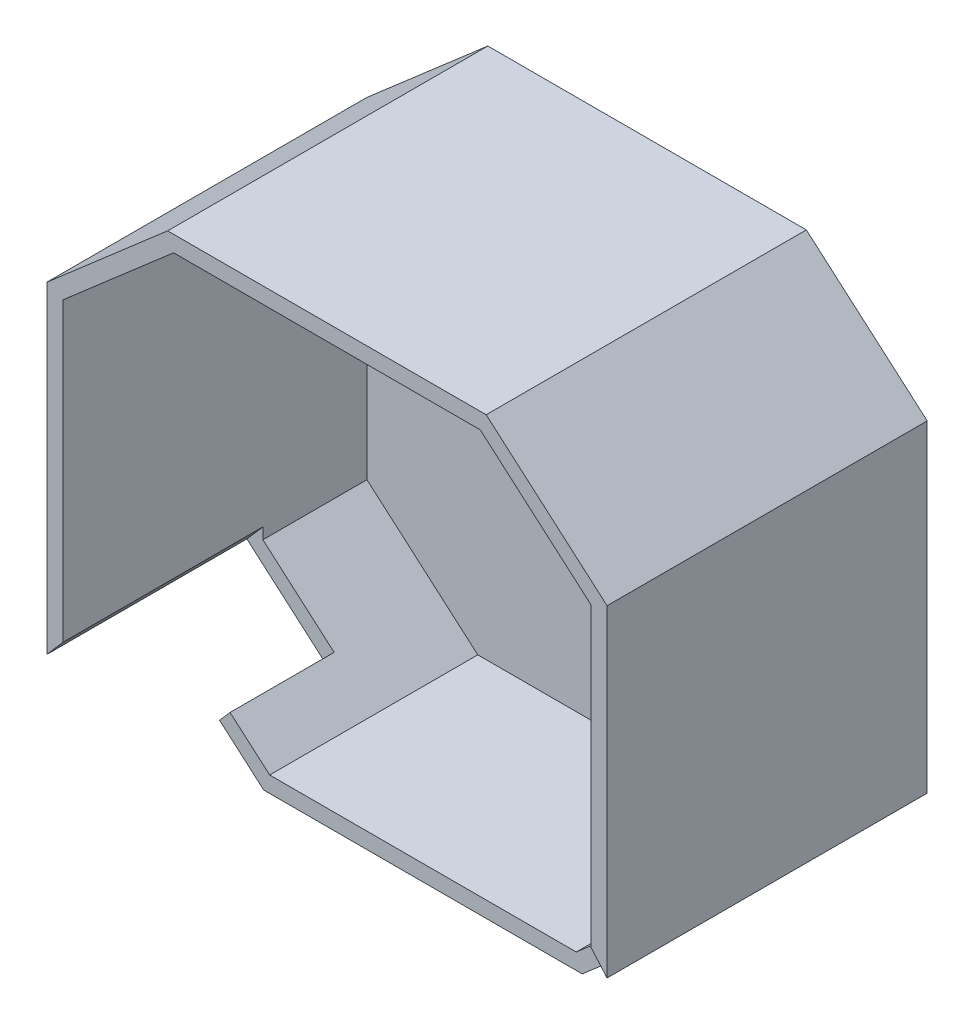
ISO-10303-21;
HEADER;
FILE_DESCRIPTION(('STEP AP214'),'2;1');
FILE_NAME('part.step','',(''),(''),'','','');
FILE_SCHEMA(('AUTOMOTIVE_DESIGN { 1 0 10303 214 1 1 1 1 }'));
ENDSEC;
DATA;
#1=APPLICATION_CONTEXT('core data for automotive mechanical design processes');
#2=APPLICATION_PROTOCOL_DEFINITION('international standard','automotive_design',2000,#1);
#3=PRODUCT_CONTEXT('',#1,'mechanical');
#4=PRODUCT('Part','Part','',(#3));
#5=PRODUCT_RELATED_PRODUCT_CATEGORY('part','',(#4));
#6=PRODUCT_DEFINITION_FORMATION('','',#4);
#7=PRODUCT_DEFINITION_CONTEXT('part definition',#1,'design');
#8=PRODUCT_DEFINITION('design','',#6,#7);
#9=PRODUCT_DEFINITION_SHAPE('','',#8);
#10=(LENGTH_UNIT() NAMED_UNIT(*) SI_UNIT(.MILLI.,.METRE.));
#11=(NAMED_UNIT(*) PLANE_ANGLE_UNIT() SI_UNIT($,.RADIAN.));
#12=(NAMED_UNIT(*) SI_UNIT($,.STERADIAN.) SOLID_ANGLE_UNIT());
#13=UNCERTAINTY_MEASURE_WITH_UNIT(LENGTH_MEASURE(1.E-05),#10,'distance_accuracy_value','');
#14=(GEOMETRIC_REPRESENTATION_CONTEXT(3) GLOBAL_UNCERTAINTY_ASSIGNED_CONTEXT((#13)) GLOBAL_UNIT_ASSIGNED_CONTEXT((#10,
#11,#12)) REPRESENTATION_CONTEXT('',''));
#15=CARTESIAN_POINT('',(0.,0.,0.));
#16=DIRECTION('',(0.,0.,1.));
#17=DIRECTION('',(1.,0.,0.));
#18=AXIS2_PLACEMENT_3D('',#15,#16,#17);
#19=CARTESIAN_POINT('',(-33.,-19.2266908634023,40.));
#20=DIRECTION('',(1.,0.,0.));
#21=DIRECTION('',(0.,0.,-1.));
#22=AXIS2_PLACEMENT_3D('',#19,#20,#21);
#23=PLANE('',#22);
#24=DIRECTION('',(0.,0.,-1.));
#25=VECTOR('',#24,1.);
#26=CARTESIAN_POINT('',(-33.,-19.2266908634023,40.));
#27=LINE('',#26,#25);
#28=CARTESIAN_POINT('',(-33.,-19.2266908634023,15.));
#29=VERTEX_POINT('',#28);
#30=CARTESIAN_POINT('',(-33.,-19.2266908634023,2.));
#31=VERTEX_POINT('',#30);
#32=EDGE_CURVE('E227',#29,#31,#27,.T.);
#33=ORIENTED_EDGE('',*,*,#32,.T.);
#34=DIRECTION('',(0.,-1.,0.));
#35=VECTOR('',#34,1.);
#36=CARTESIAN_POINT('',(-33.,-19.2266908634023,2.));
#37=LINE('',#36,#35);
#38=CARTESIAN_POINT('',(-33.,19.2266908634023,2.));
#39=VERTEX_POINT('',#38);
#40=EDGE_CURVE('E214',#39,#31,#37,.T.);
#41=ORIENTED_EDGE('',*,*,#40,.F.);
#42=DIRECTION('',(0.,0.,-1.));
#43=VECTOR('',#42,1.);
#44=CARTESIAN_POINT('',(-33.,19.2266908634023,40.));
#45=LINE('',#44,#43);
#46=CARTESIAN_POINT('',(-33.,19.2266908634023,40.));
#47=VERTEX_POINT('',#46);
#48=EDGE_CURVE('E212',#47,#39,#45,.T.);
#49=ORIENTED_EDGE('',*,*,#48,.F.);
#50=DIRECTION('',(0.,-1.,0.));
#51=VECTOR('',#50,1.);
#52=CARTESIAN_POINT('',(-33.,-19.2266908634023,40.));
#53=LINE('',#52,#51);
#54=CARTESIAN_POINT('',(-33.,-17.8350958867525,40.));
#55=VERTEX_POINT('',#54);
#56=EDGE_CURVE('E390',#47,#55,#53,.T.);
#57=ORIENTED_EDGE('',*,*,#56,.T.);
#58=DIRECTION('',(0.,0.,1.));
#59=VECTOR('',#58,1.);
#60=CARTESIAN_POINT('',(-33.,-17.8350958867525,15.));
#61=LINE('',#60,#59);
#62=CARTESIAN_POINT('',(-33.,-17.8350958867525,15.));
#63=VERTEX_POINT('',#62);
#64=EDGE_CURVE('E477',#63,#55,#61,.T.);
#65=ORIENTED_EDGE('',*,*,#64,.F.);
#66=DIRECTION('',(0.,1.,0.));
#67=VECTOR('',#66,1.);
#68=CARTESIAN_POINT('',(-33.,44.9600377626451,15.));
#69=LINE('',#68,#67);
#70=EDGE_CURVE('E351',#29,#63,#69,.T.);
#71=ORIENTED_EDGE('',*,*,#70,.F.);
#72=EDGE_LOOP('',(#33,#41,#49,#57,#65,#71));
#73=FACE_BOUND('',#72,.T.);
#74=ADVANCED_FACE('F39',(#73),#23,.T.);
#75=CARTESIAN_POINT('',(-19.15,-31.25,40.));
#76=DIRECTION('',(0.655552292940518,0.755149780653103,0.));
#77=DIRECTION('',(-0.755149780653103,0.655552292940518,0.));
#78=AXIS2_PLACEMENT_3D('',#75,#76,#77);
#79=PLANE('',#78);
#80=DIRECTION('',(0.,0.,-1.));
#81=VECTOR('',#80,1.);
#82=CARTESIAN_POINT('',(-19.15,-31.25,40.));
#83=LINE('',#82,#81);
#84=CARTESIAN_POINT('',(-19.15,-31.25,28.));
#85=VERTEX_POINT('',#84);
#86=CARTESIAN_POINT('',(-19.15,-31.25,2.));
#87=VERTEX_POINT('',#86);
#88=EDGE_CURVE('E414',#85,#87,#83,.T.);
#89=ORIENTED_EDGE('',*,*,#88,.T.);
#90=DIRECTION('',(0.755149780653103,-0.655552292940518,0.));
#91=VECTOR('',#90,1.);
#92=CARTESIAN_POINT('',(-19.15,-31.25,2.));
#93=LINE('',#92,#91);
#94=EDGE_CURVE('E428',#31,#87,#93,.T.);
#95=ORIENTED_EDGE('',*,*,#94,.F.);
#96=ORIENTED_EDGE('',*,*,#32,.F.);
#97=DIRECTION('',(-0.755149780653103,0.655552292940518,0.));
#98=VECTOR('',#97,1.);
#99=CARTESIAN_POINT('',(-33.688895414119,-18.6286545798834,15.));
#100=LINE('',#99,#98);
#101=CARTESIAN_POINT('',(-24.0984931998246,-26.954168700228,15.));
#102=VERTEX_POINT('',#101);
#103=EDGE_CURVE('E358',#102,#29,#100,.T.);
#104=ORIENTED_EDGE('',*,*,#103,.F.);
#105=DIRECTION('',(0.,0.,-1.));
#106=VECTOR('',#105,1.);
#107=CARTESIAN_POINT('',(-24.0984931998246,-26.954168700228,15.));
#108=LINE('',#107,#106);
#109=CARTESIAN_POINT('',(-24.0984931998246,-26.954168700228,28.));
#110=VERTEX_POINT('',#109);
#111=EDGE_CURVE('E474',#110,#102,#108,.T.);
#112=ORIENTED_EDGE('',*,*,#111,.F.);
#113=DIRECTION('',(0.755149780653103,-0.655552292940518,0.));
#114=VECTOR('',#113,1.);
#115=CARTESIAN_POINT('',(-56.3774509408511,1.06748382883579,28.));
#116=LINE('',#115,#114);
#117=EDGE_CURVE('E63',#110,#85,#116,.T.);
#118=ORIENTED_EDGE('',*,*,#117,.T.);
#119=EDGE_LOOP('',(#89,#95,#96,#104,#112,#118));
#120=FACE_BOUND('',#119,.T.);
#121=ADVANCED_FACE('F426',(#120),#79,.T.);
#122=CARTESIAN_POINT('',(-19.15,31.25,40.));
#123=DIRECTION('',(0.,-1.,0.));
#124=DIRECTION('',(1.,0.,0.));
#125=AXIS2_PLACEMENT_3D('',#122,#123,#124);
#126=PLANE('',#125);
#127=DIRECTION('',(0.,0.,-1.));
#128=VECTOR('',#127,1.);
#129=CARTESIAN_POINT('',(-19.15,31.25,40.));
#130=LINE('',#129,#128);
#131=CARTESIAN_POINT('',(-19.15,31.25,40.));
#132=VERTEX_POINT('',#131);
#133=CARTESIAN_POINT('',(-19.15,31.25,2.));
#134=VERTEX_POINT('',#133);
#135=EDGE_CURVE('E209',#132,#134,#130,.T.);
#136=ORIENTED_EDGE('',*,*,#135,.T.);
#137=DIRECTION('',(-1.,0.,0.));
#138=VECTOR('',#137,1.);
#139=CARTESIAN_POINT('',(-19.15,31.25,2.));
#140=LINE('',#139,#138);
#141=CARTESIAN_POINT('',(19.15,31.25,2.));
#142=VERTEX_POINT('',#141);
#143=EDGE_CURVE('E193',#142,#134,#140,.T.);
#144=ORIENTED_EDGE('',*,*,#143,.F.);
#145=DIRECTION('',(0.,0.,-1.));
#146=VECTOR('',#145,1.);
#147=CARTESIAN_POINT('',(19.15,31.25,40.));
#148=LINE('',#147,#146);
#149=CARTESIAN_POINT('',(19.15,31.25,40.));
#150=VERTEX_POINT('',#149);
#151=EDGE_CURVE('E399',#150,#142,#148,.T.);
#152=ORIENTED_EDGE('',*,*,#151,.F.);
#153=DIRECTION('',(-1.,0.,0.));
#154=VECTOR('',#153,1.);
#155=CARTESIAN_POINT('',(-19.15,31.25,40.));
#156=LINE('',#155,#154);
#157=EDGE_CURVE('E218',#150,#132,#156,.T.);
#158=ORIENTED_EDGE('',*,*,#157,.T.);
#159=EDGE_LOOP('',(#136,#144,#152,#158));
#160=FACE_BOUND('',#159,.T.);
#161=ADVANCED_FACE('F216',(#160),#126,.T.);
#162=CARTESIAN_POINT('',(-19.15,31.25,40.));
#163=DIRECTION('',(0.655552292940518,-0.755149780653103,0.));
#164=DIRECTION('',(0.755149780653103,0.655552292940518,0.));
#165=AXIS2_PLACEMENT_3D('',#162,#163,#164);
#166=PLANE('',#165);
#167=ORIENTED_EDGE('',*,*,#48,.T.);
#168=DIRECTION('',(-0.755149780653103,-0.655552292940518,0.));
#169=VECTOR('',#168,1.);
#170=CARTESIAN_POINT('',(-33.,19.2266908634023,2.));
#171=LINE('',#170,#169);
#172=EDGE_CURVE('E196',#134,#39,#171,.T.);
#173=ORIENTED_EDGE('',*,*,#172,.F.);
#174=ORIENTED_EDGE('',*,*,#135,.F.);
#175=DIRECTION('',(-0.755149780653103,-0.655552292940518,0.));
#176=VECTOR('',#175,1.);
#177=CARTESIAN_POINT('',(-19.15,31.25,40.));
#178=LINE('',#177,#176);
#179=EDGE_CURVE('E387',#132,#47,#178,.T.);
#180=ORIENTED_EDGE('',*,*,#179,.T.);
#181=EDGE_LOOP('',(#167,#173,#174,#180));
#182=FACE_BOUND('',#181,.T.);
#183=ADVANCED_FACE('F208',(#182),#166,.T.);
#184=CARTESIAN_POINT('',(-19.15,-31.25,40.));
#185=DIRECTION('',(0.,1.,0.));
#186=DIRECTION('',(0.,0.,1.));
#187=AXIS2_PLACEMENT_3D('',#184,#185,#186);
#188=PLANE('',#187);
#189=DIRECTION('',(0.,0.,-1.));
#190=VECTOR('',#189,1.);
#191=CARTESIAN_POINT('',(19.15,-31.25,40.));
#192=LINE('',#191,#190);
#193=CARTESIAN_POINT('',(19.15,-31.25,28.));
#194=VERTEX_POINT('',#193);
#195=CARTESIAN_POINT('',(19.15,-31.25,2.));
#196=VERTEX_POINT('',#195);
#197=EDGE_CURVE('E410',#194,#196,#192,.T.);
#198=ORIENTED_EDGE('',*,*,#197,.T.);
#199=DIRECTION('',(1.,0.,0.));
#200=VECTOR('',#199,1.);
#201=CARTESIAN_POINT('',(19.15,-31.25,2.));
#202=LINE('',#201,#200);
#203=EDGE_CURVE('E432',#87,#196,#202,.T.);
#204=ORIENTED_EDGE('',*,*,#203,.F.);
#205=ORIENTED_EDGE('',*,*,#88,.F.);
#206=DIRECTION('',(1.,0.,0.));
#207=VECTOR('',#206,1.);
#208=CARTESIAN_POINT('',(-28.438652094021,-31.25,28.));
#209=LINE('',#208,#207);
#210=EDGE_CURVE('E460',#85,#194,#209,.T.);
#211=ORIENTED_EDGE('',*,*,#210,.T.);
#212=EDGE_LOOP('',(#198,#204,#205,#211));
#213=FACE_BOUND('',#212,.T.);
#214=ADVANCED_FACE('F500',(#213),#188,.T.);
#215=CARTESIAN_POINT('',(19.15,-31.25,40.));
#216=DIRECTION('',(-0.655552292940518,0.755149780653103,0.));
#217=DIRECTION('',(-0.755149780653103,-0.655552292940518,0.));
#218=AXIS2_PLACEMENT_3D('',#215,#216,#217);
#219=PLANE('',#218);
#220=DIRECTION('',(0.,0.,-1.));
#221=VECTOR('',#220,1.);
#222=CARTESIAN_POINT('',(33.,-19.2266908634023,40.));
#223=LINE('',#222,#221);
#224=CARTESIAN_POINT('',(33.,-19.2266908634023,15.));
#225=VERTEX_POINT('',#224);
#226=CARTESIAN_POINT('',(33.,-19.2266908634023,2.));
#227=VERTEX_POINT('',#226);
#228=EDGE_CURVE('E406',#225,#227,#223,.T.);
#229=ORIENTED_EDGE('',*,*,#228,.T.);
#230=DIRECTION('',(0.755149780653103,0.655552292940518,0.));
#231=VECTOR('',#230,1.);
#232=CARTESIAN_POINT('',(33.,-19.2266908634023,2.));
#233=LINE('',#232,#231);
#234=EDGE_CURVE('E436',#196,#227,#233,.T.);
#235=ORIENTED_EDGE('',*,*,#234,.F.);
#236=ORIENTED_EDGE('',*,*,#197,.F.);
#237=DIRECTION('',(0.755149780653103,0.655552292940518,0.));
#238=VECTOR('',#237,1.);
#239=CARTESIAN_POINT('',(23.9431004742134,-27.0890665181054,28.));
#240=LINE('',#239,#238);
#241=CARTESIAN_POINT('',(24.0984931998246,-26.954168700228,28.));
#242=VERTEX_POINT('',#241);
#243=EDGE_CURVE('E464',#194,#242,#240,.T.);
#244=ORIENTED_EDGE('',*,*,#243,.T.);
#245=DIRECTION('',(0.,0.,-1.));
#246=VECTOR('',#245,1.);
#247=CARTESIAN_POINT('',(24.0984931998246,-26.954168700228,15.));
#248=LINE('',#247,#246);
#249=CARTESIAN_POINT('',(24.0984931998246,-26.954168700228,15.));
#250=VERTEX_POINT('',#249);
#251=EDGE_CURVE('E375',#242,#250,#248,.T.);
#252=ORIENTED_EDGE('',*,*,#251,.T.);
#253=DIRECTION('',(0.755149780653103,0.655552292940518,0.));
#254=VECTOR('',#253,1.);
#255=CARTESIAN_POINT('',(33.688895414119,-18.6286545798834,15.));
#256=LINE('',#255,#254);
#257=EDGE_CURVE('E350',#250,#225,#256,.T.);
#258=ORIENTED_EDGE('',*,*,#257,.T.);
#259=EDGE_LOOP('',(#229,#235,#236,#244,#252,#258));
#260=FACE_BOUND('',#259,.T.);
#261=ADVANCED_FACE('F504',(#260),#219,.T.);
#262=CARTESIAN_POINT('',(33.,-19.2266908634023,40.));
#263=DIRECTION('',(-1.,0.,0.));
#264=DIRECTION('',(0.,0.,1.));
#265=AXIS2_PLACEMENT_3D('',#262,#263,#264);
#266=PLANE('',#265);
#267=DIRECTION('',(0.,0.,-1.));
#268=VECTOR('',#267,1.);
#269=CARTESIAN_POINT('',(33.,19.2266908634023,40.));
#270=LINE('',#269,#268);
#271=CARTESIAN_POINT('',(33.,19.2266908634023,40.));
#272=VERTEX_POINT('',#271);
#273=CARTESIAN_POINT('',(33.,19.2266908634023,2.));
#274=VERTEX_POINT('',#273);
#275=EDGE_CURVE('E402',#272,#274,#270,.T.);
#276=ORIENTED_EDGE('',*,*,#275,.T.);
#277=DIRECTION('',(0.,1.,0.));
#278=VECTOR('',#277,1.);
#279=CARTESIAN_POINT('',(33.,19.2266908634023,2.));
#280=LINE('',#279,#278);
#281=EDGE_CURVE('E55',#227,#274,#280,.T.);
#282=ORIENTED_EDGE('',*,*,#281,.F.);
#283=ORIENTED_EDGE('',*,*,#228,.F.);
#284=DIRECTION('',(0.,1.,0.));
#285=VECTOR('',#284,1.);
#286=CARTESIAN_POINT('',(33.,44.9600377626451,15.));
#287=LINE('',#286,#285);
#288=CARTESIAN_POINT('',(33.,-17.8350958867525,15.));
#289=VERTEX_POINT('',#288);
#290=EDGE_CURVE('E381',#225,#289,#287,.T.);
#291=ORIENTED_EDGE('',*,*,#290,.T.);
#292=DIRECTION('',(0.,0.,1.));
#293=VECTOR('',#292,1.);
#294=CARTESIAN_POINT('',(33.,-17.8350958867525,15.));
#295=LINE('',#294,#293);
#296=CARTESIAN_POINT('',(33.,-17.8350958867525,40.));
#297=VERTEX_POINT('',#296);
#298=EDGE_CURVE('E356',#289,#297,#295,.T.);
#299=ORIENTED_EDGE('',*,*,#298,.T.);
#300=DIRECTION('',(0.,1.,0.));
#301=VECTOR('',#300,1.);
#302=CARTESIAN_POINT('',(33.,-19.2266908634023,40.));
#303=LINE('',#302,#301);
#304=EDGE_CURVE('E346',#297,#272,#303,.T.);
#305=ORIENTED_EDGE('',*,*,#304,.T.);
#306=EDGE_LOOP('',(#276,#282,#283,#291,#299,#305));
#307=FACE_BOUND('',#306,.T.);
#308=ADVANCED_FACE('F508',(#307),#266,.T.);
#309=CARTESIAN_POINT('',(19.15,31.25,40.));
#310=DIRECTION('',(-0.655552292940518,-0.755149780653103,0.));
#311=DIRECTION('',(0.755149780653103,-0.655552292940518,0.));
#312=AXIS2_PLACEMENT_3D('',#309,#310,#311);
#313=PLANE('',#312);
#314=ORIENTED_EDGE('',*,*,#151,.T.);
#315=DIRECTION('',(-0.755149780653103,0.655552292940518,0.));
#316=VECTOR('',#315,1.);
#317=CARTESIAN_POINT('',(19.15,31.25,2.));
#318=LINE('',#317,#316);
#319=EDGE_CURVE('E198',#274,#142,#318,.T.);
#320=ORIENTED_EDGE('',*,*,#319,.F.);
#321=ORIENTED_EDGE('',*,*,#275,.F.);
#322=DIRECTION('',(-0.755149780653103,0.655552292940518,0.));
#323=VECTOR('',#322,1.);
#324=CARTESIAN_POINT('',(19.15,31.25,40.));
#325=LINE('',#324,#323);
#326=EDGE_CURVE('E396',#272,#150,#325,.T.);
#327=ORIENTED_EDGE('',*,*,#326,.T.);
#328=EDGE_LOOP('',(#314,#320,#321,#327));
#329=FACE_BOUND('',#328,.T.);
#330=ADVANCED_FACE('F511',(#329),#313,.T.);
#331=CARTESIAN_POINT('',(0.,0.,40.));
#332=DIRECTION('',(0.,0.,1.));
#333=DIRECTION('',(1.,0.,0.));
#334=AXIS2_PLACEMENT_3D('',#331,#332,#333);
#335=PLANE('',#334);
#336=DIRECTION('',(0.,-1.,0.));
#337=VECTOR('',#336,1.);
#338=CARTESIAN_POINT('',(-35.,-20.1389541411896,40.));
#339=LINE('',#338,#337);
#340=CARTESIAN_POINT('',(-35.,20.1389541411896,40.));
#341=VERTEX_POINT('',#340);
#342=CARTESIAN_POINT('',(-35.,-20.1389541411896,40.));
#343=VERTEX_POINT('',#342);
#344=EDGE_CURVE('E239',#341,#343,#339,.T.);
#345=ORIENTED_EDGE('',*,*,#344,.T.);
#346=DIRECTION('',(-0.655552292940518,-0.755149780653103,0.));
#347=VECTOR('',#346,1.);
#348=CARTESIAN_POINT('',(21.513018349507,44.9600377626451,40.));
#349=LINE('',#348,#347);
#350=EDGE_CURVE('E471',#55,#343,#349,.T.);
#351=ORIENTED_EDGE('',*,*,#350,.F.);
#352=ORIENTED_EDGE('',*,*,#56,.F.);
#353=ORIENTED_EDGE('',*,*,#179,.F.);
#354=ORIENTED_EDGE('',*,*,#157,.F.);
#355=ORIENTED_EDGE('',*,*,#326,.F.);
#356=ORIENTED_EDGE('',*,*,#304,.F.);
#357=DIRECTION('',(0.655552292940518,-0.755149780653103,0.));
#358=VECTOR('',#357,1.);
#359=CARTESIAN_POINT('',(-21.513018349507,44.9600377626451,40.));
#360=LINE('',#359,#358);
#361=CARTESIAN_POINT('',(35.,-20.1389541411896,40.));
#362=VERTEX_POINT('',#361);
#363=EDGE_CURVE('E344',#297,#362,#360,.T.);
#364=ORIENTED_EDGE('',*,*,#363,.T.);
#365=DIRECTION('',(0.,1.,0.));
#366=VECTOR('',#365,1.);
#367=CARTESIAN_POINT('',(35.,-20.1389541411896,40.));
#368=LINE('',#367,#366);
#369=CARTESIAN_POINT('',(35.,20.1389541411896,40.));
#370=VERTEX_POINT('',#369);
#371=EDGE_CURVE('E243',#362,#370,#368,.T.);
#372=ORIENTED_EDGE('',*,*,#371,.T.);
#373=DIRECTION('',(-0.755149780653103,0.655552292940518,0.));
#374=VECTOR('',#373,1.);
#375=CARTESIAN_POINT('',(19.8970043869379,33.25,40.));
#376=LINE('',#375,#374);
#377=CARTESIAN_POINT('',(19.8970043869379,33.25,40.));
#378=VERTEX_POINT('',#377);
#379=EDGE_CURVE('E246',#370,#378,#376,.T.);
#380=ORIENTED_EDGE('',*,*,#379,.T.);
#381=DIRECTION('',(-1.,0.,0.));
#382=VECTOR('',#381,1.);
#383=CARTESIAN_POINT('',(-19.8970043869379,33.25,40.));
#384=LINE('',#383,#382);
#385=CARTESIAN_POINT('',(-19.8970043869379,33.25,40.));
#386=VERTEX_POINT('',#385);
#387=EDGE_CURVE('E231',#378,#386,#384,.T.);
#388=ORIENTED_EDGE('',*,*,#387,.T.);
#389=DIRECTION('',(-0.755149780653103,-0.655552292940518,0.));
#390=VECTOR('',#389,1.);
#391=CARTESIAN_POINT('',(-19.8970043869379,33.25,40.));
#392=LINE('',#391,#390);
#393=EDGE_CURVE('E235',#386,#341,#392,.T.);
#394=ORIENTED_EDGE('',*,*,#393,.T.);
#395=EDGE_LOOP('',(#345,#351,#352,#353,#354,#355,#356,#364,#372,#380,#388,#394));
#396=FACE_BOUND('',#395,.T.);
#397=ADVANCED_FACE('F341',(#396),#335,.T.);
#398=CARTESIAN_POINT('',(-19.8970043869379,-33.25,40.));
#399=DIRECTION('',(0.655552292940518,0.755149780653103,0.));
#400=DIRECTION('',(-0.755149780653103,0.655552292940518,0.));
#401=AXIS2_PLACEMENT_3D('',#398,#399,#400);
#402=PLANE('',#401);
#403=DIRECTION('',(0.,0.,-1.));
#404=VECTOR('',#403,1.);
#405=CARTESIAN_POINT('',(-19.8970043869379,-33.25,40.));
#406=LINE('',#405,#404);
#407=CARTESIAN_POINT('',(-19.8970043869379,-33.25,28.));
#408=VERTEX_POINT('',#407);
#409=CARTESIAN_POINT('',(-19.8970043869379,-33.25,0.));
#410=VERTEX_POINT('',#409);
#411=EDGE_CURVE('E288',#408,#410,#406,.T.);
#412=ORIENTED_EDGE('',*,*,#411,.F.);
#413=DIRECTION('',(0.755149780653103,-0.655552292940518,0.));
#414=VECTOR('',#413,1.);
#415=CARTESIAN_POINT('',(-57.6885555267321,-0.44281573247041,28.));
#416=LINE('',#415,#414);
#417=CARTESIAN_POINT('',(-25.4095977857056,-28.4644682615342,28.));
#418=VERTEX_POINT('',#417);
#419=EDGE_CURVE('E449',#418,#408,#416,.T.);
#420=ORIENTED_EDGE('',*,*,#419,.F.);
#421=DIRECTION('',(0.,0.,-1.));
#422=VECTOR('',#421,1.);
#423=CARTESIAN_POINT('',(-25.4095977857056,-28.4644682615342,15.));
#424=LINE('',#423,#422);
#425=CARTESIAN_POINT('',(-25.4095977857056,-28.4644682615342,15.));
#426=VERTEX_POINT('',#425);
#427=EDGE_CURVE('E482',#418,#426,#424,.T.);
#428=ORIENTED_EDGE('',*,*,#427,.T.);
#429=DIRECTION('',(-0.755149780653103,0.655552292940518,0.));
#430=VECTOR('',#429,1.);
#431=CARTESIAN_POINT('',(-35.,-20.1389541411896,15.));
#432=LINE('',#431,#430);
#433=CARTESIAN_POINT('',(-35.,-20.1389541411896,15.));
#434=VERTEX_POINT('',#433);
#435=EDGE_CURVE('E317',#426,#434,#432,.T.);
#436=ORIENTED_EDGE('',*,*,#435,.T.);
#437=DIRECTION('',(0.,0.,-1.));
#438=VECTOR('',#437,1.);
#439=CARTESIAN_POINT('',(-35.,-20.1389541411896,40.));
#440=LINE('',#439,#438);
#441=CARTESIAN_POINT('',(-35.,-20.1389541411896,0.));
#442=VERTEX_POINT('',#441);
#443=EDGE_CURVE('E291',#434,#442,#440,.T.);
#444=ORIENTED_EDGE('',*,*,#443,.T.);
#445=DIRECTION('',(0.755149780653103,-0.655552292940518,0.));
#446=VECTOR('',#445,1.);
#447=CARTESIAN_POINT('',(-19.8970043869379,-33.25,0.));
#448=LINE('',#447,#446);
#449=EDGE_CURVE('E256',#442,#410,#448,.T.);
#450=ORIENTED_EDGE('',*,*,#449,.T.);
#451=EDGE_LOOP('',(#412,#420,#428,#436,#444,#450));
#452=FACE_BOUND('',#451,.T.);
#453=ADVANCED_FACE('F313',(#452),#402,.F.);
#454=CARTESIAN_POINT('',(0.,0.,0.));
#455=DIRECTION('',(0.,0.,1.));
#456=DIRECTION('',(1.,0.,0.));
#457=AXIS2_PLACEMENT_3D('',#454,#455,#456);
#458=PLANE('',#457);
#459=DIRECTION('',(-1.,0.,0.));
#460=VECTOR('',#459,1.);
#461=CARTESIAN_POINT('',(-19.8970043869379,33.25,0.));
#462=LINE('',#461,#460);
#463=CARTESIAN_POINT('',(19.8970043869379,33.25,0.));
#464=VERTEX_POINT('',#463);
#465=CARTESIAN_POINT('',(-19.8970043869379,33.25,0.));
#466=VERTEX_POINT('',#465);
#467=EDGE_CURVE('E220',#464,#466,#462,.T.);
#468=ORIENTED_EDGE('',*,*,#467,.F.);
#469=DIRECTION('',(-0.755149780653103,0.655552292940518,0.));
#470=VECTOR('',#469,1.);
#471=CARTESIAN_POINT('',(19.8970043869379,33.25,0.));
#472=LINE('',#471,#470);
#473=CARTESIAN_POINT('',(35.,20.1389541411896,0.));
#474=VERTEX_POINT('',#473);
#475=EDGE_CURVE('E236',#474,#464,#472,.T.);
#476=ORIENTED_EDGE('',*,*,#475,.F.);
#477=DIRECTION('',(0.,1.,0.));
#478=VECTOR('',#477,1.);
#479=CARTESIAN_POINT('',(35.,-20.1389541411896,0.));
#480=LINE('',#479,#478);
#481=CARTESIAN_POINT('',(35.,-20.1389541411896,0.));
#482=VERTEX_POINT('',#481);
#483=EDGE_CURVE('E268',#482,#474,#480,.T.);
#484=ORIENTED_EDGE('',*,*,#483,.F.);
#485=DIRECTION('',(0.755149780653103,0.655552292940518,0.));
#486=VECTOR('',#485,1.);
#487=CARTESIAN_POINT('',(19.8970043869379,-33.25,0.));
#488=LINE('',#487,#486);
#489=CARTESIAN_POINT('',(19.8970043869379,-33.25,0.));
#490=VERTEX_POINT('',#489);
#491=EDGE_CURVE('E264',#490,#482,#488,.T.);
#492=ORIENTED_EDGE('',*,*,#491,.F.);
#493=DIRECTION('',(1.,0.,0.));
#494=VECTOR('',#493,1.);
#495=CARTESIAN_POINT('',(-19.8970043869379,-33.25,0.));
#496=LINE('',#495,#494);
#497=EDGE_CURVE('E260',#410,#490,#496,.T.);
#498=ORIENTED_EDGE('',*,*,#497,.F.);
#499=ORIENTED_EDGE('',*,*,#449,.F.);
#500=DIRECTION('',(0.,-1.,0.));
#501=VECTOR('',#500,1.);
#502=CARTESIAN_POINT('',(-35.,-20.1389541411896,0.));
#503=LINE('',#502,#501);
#504=CARTESIAN_POINT('',(-35.,20.1389541411896,0.));
#505=VERTEX_POINT('',#504);
#506=EDGE_CURVE('E252',#505,#442,#503,.T.);
#507=ORIENTED_EDGE('',*,*,#506,.F.);
#508=DIRECTION('',(-0.755149780653103,-0.655552292940518,0.));
#509=VECTOR('',#508,1.);
#510=CARTESIAN_POINT('',(-19.8970043869379,33.25,0.));
#511=LINE('',#510,#509);
#512=EDGE_CURVE('E225',#466,#505,#511,.T.);
#513=ORIENTED_EDGE('',*,*,#512,.F.);
#514=EDGE_LOOP('',(#468,#476,#484,#492,#498,#499,#507,#513));
#515=FACE_BOUND('',#514,.T.);
#516=ADVANCED_FACE('F308',(#515),#458,.F.);
#517=CARTESIAN_POINT('',(-19.8970043869379,33.25,40.));
#518=DIRECTION('',(0.,-1.,0.));
#519=DIRECTION('',(0.,0.,-1.));
#520=AXIS2_PLACEMENT_3D('',#517,#518,#519);
#521=PLANE('',#520);
#522=ORIENTED_EDGE('',*,*,#467,.T.);
#523=DIRECTION('',(0.,0.,-1.));
#524=VECTOR('',#523,1.);
#525=CARTESIAN_POINT('',(-19.8970043869379,33.25,40.));
#526=LINE('',#525,#524);
#527=EDGE_CURVE('E11',#386,#466,#526,.T.);
#528=ORIENTED_EDGE('',*,*,#527,.F.);
#529=ORIENTED_EDGE('',*,*,#387,.F.);
#530=DIRECTION('',(0.,0.,-1.));
#531=VECTOR('',#530,1.);
#532=CARTESIAN_POINT('',(19.8970043869379,33.25,40.));
#533=LINE('',#532,#531);
#534=EDGE_CURVE('E248',#378,#464,#533,.T.);
#535=ORIENTED_EDGE('',*,*,#534,.T.);
#536=EDGE_LOOP('',(#522,#528,#529,#535));
#537=FACE_BOUND('',#536,.T.);
#538=ADVANCED_FACE('F41',(#537),#521,.F.);
#539=CARTESIAN_POINT('',(-19.8970043869379,33.25,40.));
#540=DIRECTION('',(0.655552292940518,-0.755149780653103,0.));
#541=DIRECTION('',(0.755149780653103,0.655552292940518,0.));
#542=AXIS2_PLACEMENT_3D('',#539,#540,#541);
#543=PLANE('',#542);
#544=ORIENTED_EDGE('',*,*,#512,.T.);
#545=DIRECTION('',(0.,0.,-1.));
#546=VECTOR('',#545,1.);
#547=CARTESIAN_POINT('',(-35.,20.1389541411896,40.));
#548=LINE('',#547,#546);
#549=EDGE_CURVE('E48',#341,#505,#548,.T.);
#550=ORIENTED_EDGE('',*,*,#549,.F.);
#551=ORIENTED_EDGE('',*,*,#393,.F.);
#552=ORIENTED_EDGE('',*,*,#527,.T.);
#553=EDGE_LOOP('',(#544,#550,#551,#552));
#554=FACE_BOUND('',#553,.T.);
#555=ADVANCED_FACE('F557',(#554),#543,.F.);
#556=CARTESIAN_POINT('',(-35.,-20.1389541411896,40.));
#557=DIRECTION('',(1.,0.,0.));
#558=DIRECTION('',(0.,0.,-1.));
#559=AXIS2_PLACEMENT_3D('',#556,#557,#558);
#560=PLANE('',#559);
#561=ORIENTED_EDGE('',*,*,#506,.T.);
#562=ORIENTED_EDGE('',*,*,#443,.F.);
#563=EDGE_CURVE('E292',#343,#434,#440,.T.);
#564=ORIENTED_EDGE('',*,*,#563,.F.);
#565=ORIENTED_EDGE('',*,*,#344,.F.);
#566=ORIENTED_EDGE('',*,*,#549,.T.);
#567=EDGE_LOOP('',(#561,#562,#564,#565,#566));
#568=FACE_BOUND('',#567,.T.);
#569=ADVANCED_FACE('F301',(#568),#560,.F.);
#570=CARTESIAN_POINT('',(-19.8970043869379,-33.25,40.));
#571=DIRECTION('',(0.,1.,0.));
#572=DIRECTION('',(0.,0.,1.));
#573=AXIS2_PLACEMENT_3D('',#570,#571,#572);
#574=PLANE('',#573);
#575=DIRECTION('',(0.,0.,-1.));
#576=VECTOR('',#575,1.);
#577=CARTESIAN_POINT('',(19.8970043869379,-33.25,40.));
#578=LINE('',#577,#576);
#579=CARTESIAN_POINT('',(19.8970043869379,-33.25,28.));
#580=VERTEX_POINT('',#579);
#581=EDGE_CURVE('E285',#580,#490,#578,.T.);
#582=ORIENTED_EDGE('',*,*,#581,.F.);
#583=DIRECTION('',(1.,0.,0.));
#584=VECTOR('',#583,1.);
#585=CARTESIAN_POINT('',(-28.438652094021,-33.25,28.));
#586=LINE('',#585,#584);
#587=EDGE_CURVE('E452',#408,#580,#586,.T.);
#588=ORIENTED_EDGE('',*,*,#587,.F.);
#589=ORIENTED_EDGE('',*,*,#411,.T.);
#590=ORIENTED_EDGE('',*,*,#497,.T.);
#591=EDGE_LOOP('',(#582,#588,#589,#590));
#592=FACE_BOUND('',#591,.T.);
#593=ADVANCED_FACE('F550',(#592),#574,.F.);
#594=CARTESIAN_POINT('',(19.8970043869379,-33.25,40.));
#595=DIRECTION('',(-0.655552292940518,0.755149780653103,0.));
#596=DIRECTION('',(-0.755149780653103,-0.655552292940518,0.));
#597=AXIS2_PLACEMENT_3D('',#594,#595,#596);
#598=PLANE('',#597);
#599=DIRECTION('',(0.,0.,-1.));
#600=VECTOR('',#599,1.);
#601=CARTESIAN_POINT('',(25.4095977857056,-28.4644682615342,15.));
#602=LINE('',#601,#600);
#603=CARTESIAN_POINT('',(25.4095977857056,-28.4644682615342,28.));
#604=VERTEX_POINT('',#603);
#605=CARTESIAN_POINT('',(25.4095977857056,-28.4644682615342,15.));
#606=VERTEX_POINT('',#605);
#607=EDGE_CURVE('E364',#604,#606,#602,.T.);
#608=ORIENTED_EDGE('',*,*,#607,.F.);
#609=DIRECTION('',(0.755149780653103,0.655552292940518,0.));
#610=VECTOR('',#609,1.);
#611=CARTESIAN_POINT('',(25.2542050600945,-28.5993660794116,28.));
#612=LINE('',#611,#610);
#613=EDGE_CURVE('E446',#580,#604,#612,.T.);
#614=ORIENTED_EDGE('',*,*,#613,.F.);
#615=ORIENTED_EDGE('',*,*,#581,.T.);
#616=ORIENTED_EDGE('',*,*,#491,.T.);
#617=DIRECTION('',(0.,0.,-1.));
#618=VECTOR('',#617,1.);
#619=CARTESIAN_POINT('',(35.,-20.1389541411896,40.));
#620=LINE('',#619,#618);
#621=CARTESIAN_POINT('',(35.,-20.1389541411896,15.));
#622=VERTEX_POINT('',#621);
#623=EDGE_CURVE('E280',#622,#482,#620,.T.);
#624=ORIENTED_EDGE('',*,*,#623,.F.);
#625=DIRECTION('',(0.755149780653103,0.655552292940518,0.));
#626=VECTOR('',#625,1.);
#627=CARTESIAN_POINT('',(35.,-20.1389541411896,15.));
#628=LINE('',#627,#626);
#629=EDGE_CURVE('E367',#606,#622,#628,.T.);
#630=ORIENTED_EDGE('',*,*,#629,.F.);
#631=EDGE_LOOP('',(#608,#614,#615,#616,#624,#630));
#632=FACE_BOUND('',#631,.T.);
#633=ADVANCED_FACE('F329',(#632),#598,.F.);
#634=CARTESIAN_POINT('',(35.,-20.1389541411896,40.));
#635=DIRECTION('',(-1.,0.,0.));
#636=DIRECTION('',(0.,0.,1.));
#637=AXIS2_PLACEMENT_3D('',#634,#635,#636);
#638=PLANE('',#637);
#639=ORIENTED_EDGE('',*,*,#483,.T.);
#640=DIRECTION('',(0.,0.,-1.));
#641=VECTOR('',#640,1.);
#642=CARTESIAN_POINT('',(35.,20.1389541411896,40.));
#643=LINE('',#642,#641);
#644=EDGE_CURVE('E276',#370,#474,#643,.T.);
#645=ORIENTED_EDGE('',*,*,#644,.F.);
#646=ORIENTED_EDGE('',*,*,#371,.F.);
#647=EDGE_CURVE('E281',#362,#622,#620,.T.);
#648=ORIENTED_EDGE('',*,*,#647,.T.);
#649=ORIENTED_EDGE('',*,*,#623,.T.);
#650=EDGE_LOOP('',(#639,#645,#646,#648,#649));
#651=FACE_BOUND('',#650,.T.);
#652=ADVANCED_FACE('F322',(#651),#638,.F.);
#653=CARTESIAN_POINT('',(19.8970043869379,33.25,40.));
#654=DIRECTION('',(-0.655552292940518,-0.755149780653103,0.));
#655=DIRECTION('',(0.755149780653103,-0.655552292940518,0.));
#656=AXIS2_PLACEMENT_3D('',#653,#654,#655);
#657=PLANE('',#656);
#658=ORIENTED_EDGE('',*,*,#475,.T.);
#659=ORIENTED_EDGE('',*,*,#534,.F.);
#660=ORIENTED_EDGE('',*,*,#379,.F.);
#661=ORIENTED_EDGE('',*,*,#644,.T.);
#662=EDGE_LOOP('',(#658,#659,#660,#661));
#663=FACE_BOUND('',#662,.T.);
#664=ADVANCED_FACE('F335',(#663),#657,.F.);
#665=CARTESIAN_POINT('',(-31.1034205638014,36.6345236423005,15.));
#666=DIRECTION('',(-0.755149780653103,-0.655552292940518,0.));
#667=DIRECTION('',(0.655552292940518,-0.755149780653103,0.));
#668=AXIS2_PLACEMENT_3D('',#665,#666,#667);
#669=PLANE('',#668);
#670=ORIENTED_EDGE('',*,*,#251,.F.);
#671=DIRECTION('',(-0.655552292940518,0.755149780653103,0.));
#672=VECTOR('',#671,1.);
#673=CARTESIAN_POINT('',(-28.2832593684098,33.3858978178774,28.));
#674=LINE('',#673,#672);
#675=EDGE_CURVE('E468',#604,#242,#674,.T.);
#676=ORIENTED_EDGE('',*,*,#675,.F.);
#677=ORIENTED_EDGE('',*,*,#607,.T.);
#678=DIRECTION('',(0.655552292940518,-0.755149780653103,0.));
#679=VECTOR('',#678,1.);
#680=CARTESIAN_POINT('',(-31.1034205638014,36.6345236423005,15.));
#681=LINE('',#680,#679);
#682=EDGE_CURVE('E371',#250,#606,#681,.T.);
#683=ORIENTED_EDGE('',*,*,#682,.F.);
#684=EDGE_LOOP('',(#670,#676,#677,#683));
#685=FACE_BOUND('',#684,.T.);
#686=ADVANCED_FACE('F545',(#685),#669,.F.);
#687=CARTESIAN_POINT('',(-21.513018349507,44.9600377626451,15.));
#688=DIRECTION('',(0.,0.,-1.));
#689=DIRECTION('',(-1.,0.,0.));
#690=AXIS2_PLACEMENT_3D('',#687,#688,#689);
#691=PLANE('',#690);
#692=ORIENTED_EDGE('',*,*,#682,.T.);
#693=ORIENTED_EDGE('',*,*,#629,.T.);
#694=DIRECTION('',(0.655552292940518,-0.755149780653103,0.));
#695=VECTOR('',#694,1.);
#696=CARTESIAN_POINT('',(-21.513018349507,44.9600377626451,15.));
#697=LINE('',#696,#695);
#698=EDGE_CURVE('E372',#289,#622,#697,.T.);
#699=ORIENTED_EDGE('',*,*,#698,.F.);
#700=ORIENTED_EDGE('',*,*,#290,.F.);
#701=ORIENTED_EDGE('',*,*,#257,.F.);
#702=EDGE_LOOP('',(#692,#693,#699,#700,#701));
#703=FACE_BOUND('',#702,.T.);
#704=ADVANCED_FACE('F644',(#703),#691,.F.);
#705=CARTESIAN_POINT('',(-21.513018349507,44.9600377626451,15.));
#706=DIRECTION('',(0.755149780653103,0.655552292940518,0.));
#707=DIRECTION('',(-0.655552292940518,0.755149780653103,0.));
#708=AXIS2_PLACEMENT_3D('',#705,#706,#707);
#709=PLANE('',#708);
#710=ORIENTED_EDGE('',*,*,#298,.F.);
#711=ORIENTED_EDGE('',*,*,#698,.T.);
#712=ORIENTED_EDGE('',*,*,#647,.F.);
#713=ORIENTED_EDGE('',*,*,#363,.F.);
#714=EDGE_LOOP('',(#710,#711,#712,#713));
#715=FACE_BOUND('',#714,.T.);
#716=ADVANCED_FACE('F672',(#715),#709,.F.);
#717=CARTESIAN_POINT('',(21.513018349507,44.9600377626451,15.));
#718=DIRECTION('',(0.,0.,1.));
#719=DIRECTION('',(1.,0.,0.));
#720=AXIS2_PLACEMENT_3D('',#717,#718,#719);
#721=PLANE('',#720);
#722=ORIENTED_EDGE('',*,*,#70,.T.);
#723=DIRECTION('',(-0.655552292940518,-0.755149780653103,0.));
#724=VECTOR('',#723,1.);
#725=CARTESIAN_POINT('',(21.513018349507,44.9600377626451,15.));
#726=LINE('',#725,#724);
#727=EDGE_CURVE('E485',#63,#434,#726,.T.);
#728=ORIENTED_EDGE('',*,*,#727,.T.);
#729=ORIENTED_EDGE('',*,*,#435,.F.);
#730=DIRECTION('',(-0.655552292940518,-0.755149780653103,0.));
#731=VECTOR('',#730,1.);
#732=CARTESIAN_POINT('',(31.1034205638014,36.6345236423005,15.));
#733=LINE('',#732,#731);
#734=EDGE_CURVE('E486',#102,#426,#733,.T.);
#735=ORIENTED_EDGE('',*,*,#734,.F.);
#736=ORIENTED_EDGE('',*,*,#103,.T.);
#737=EDGE_LOOP('',(#722,#728,#729,#735,#736));
#738=FACE_BOUND('',#737,.T.);
#739=ADVANCED_FACE('F494',(#738),#721,.T.);
#740=CARTESIAN_POINT('',(31.1034205638014,36.6345236423005,15.));
#741=DIRECTION('',(-0.755149780653103,0.655552292940518,0.));
#742=DIRECTION('',(-0.655552292940518,-0.755149780653103,0.));
#743=AXIS2_PLACEMENT_3D('',#740,#741,#742);
#744=PLANE('',#743);
#745=DIRECTION('',(0.655552292940518,0.755149780653103,0.));
#746=VECTOR('',#745,1.);
#747=CARTESIAN_POINT('',(3.84030564700552,5.22934747093623,28.));
#748=LINE('',#747,#746);
#749=EDGE_CURVE('E455',#418,#110,#748,.T.);
#750=ORIENTED_EDGE('',*,*,#749,.T.);
#751=ORIENTED_EDGE('',*,*,#111,.T.);
#752=ORIENTED_EDGE('',*,*,#734,.T.);
#753=ORIENTED_EDGE('',*,*,#427,.F.);
#754=EDGE_LOOP('',(#750,#751,#752,#753));
#755=FACE_BOUND('',#754,.T.);
#756=ADVANCED_FACE('F498',(#755),#744,.T.);
#757=CARTESIAN_POINT('',(21.513018349507,44.9600377626451,15.));
#758=DIRECTION('',(0.755149780653103,-0.655552292940518,0.));
#759=DIRECTION('',(0.655552292940518,0.755149780653103,0.));
#760=AXIS2_PLACEMENT_3D('',#757,#758,#759);
#761=PLANE('',#760);
#762=ORIENTED_EDGE('',*,*,#350,.T.);
#763=ORIENTED_EDGE('',*,*,#563,.T.);
#764=ORIENTED_EDGE('',*,*,#727,.F.);
#765=ORIENTED_EDGE('',*,*,#64,.T.);
#766=EDGE_LOOP('',(#762,#763,#764,#765));
#767=FACE_BOUND('',#766,.T.);
#768=ADVANCED_FACE('F515',(#767),#761,.T.);
#769=CARTESIAN_POINT('',(-28.438652094021,33.251,28.));
#770=DIRECTION('',(0.,0.,-1.));
#771=DIRECTION('',(-1.,0.,0.));
#772=AXIS2_PLACEMENT_3D('',#769,#770,#771);
#773=PLANE('',#772);
#774=ORIENTED_EDGE('',*,*,#613,.T.);
#775=ORIENTED_EDGE('',*,*,#675,.T.);
#776=ORIENTED_EDGE('',*,*,#243,.F.);
#777=ORIENTED_EDGE('',*,*,#210,.F.);
#778=ORIENTED_EDGE('',*,*,#117,.F.);
#779=ORIENTED_EDGE('',*,*,#749,.F.);
#780=ORIENTED_EDGE('',*,*,#419,.T.);
#781=ORIENTED_EDGE('',*,*,#587,.T.);
#782=EDGE_LOOP('',(#774,#775,#776,#777,#778,#779,#780,#781));
#783=FACE_BOUND('',#782,.T.);
#784=ADVANCED_FACE('F517',(#783),#773,.F.);
#785=CARTESIAN_POINT('',(0.,0.,2.));
#786=DIRECTION('',(0.,0.,-1.));
#787=DIRECTION('',(-1.,0.,0.));
#788=AXIS2_PLACEMENT_3D('',#785,#786,#787);
#789=PLANE('',#788);
#790=ORIENTED_EDGE('',*,*,#143,.T.);
#791=ORIENTED_EDGE('',*,*,#172,.T.);
#792=ORIENTED_EDGE('',*,*,#40,.T.);
#793=ORIENTED_EDGE('',*,*,#94,.T.);
#794=ORIENTED_EDGE('',*,*,#203,.T.);
#795=ORIENTED_EDGE('',*,*,#234,.T.);
#796=ORIENTED_EDGE('',*,*,#281,.T.);
#797=ORIENTED_EDGE('',*,*,#319,.T.);
#798=EDGE_LOOP('',(#790,#791,#792,#793,#794,#795,#796,#797));
#799=FACE_BOUND('',#798,.T.);
#800=ADVANCED_FACE('F195',(#799),#789,.F.);
#801=CLOSED_SHELL('',(#74,#121,#161,#183,#214,#261,#308,#330,#397,#453,#516,#538,#555,#569,#593,
#633,#652,#664,#686,#704,#716,#739,#756,#768,#784,#800));
#802=MANIFOLD_SOLID_BREP('B2',#801);
#803=ADVANCED_BREP_SHAPE_REPRESENTATION('',(#18,#802),#14);
#804=SHAPE_DEFINITION_REPRESENTATION(#9,#803);
ENDSEC;
END-ISO-10303-21;
